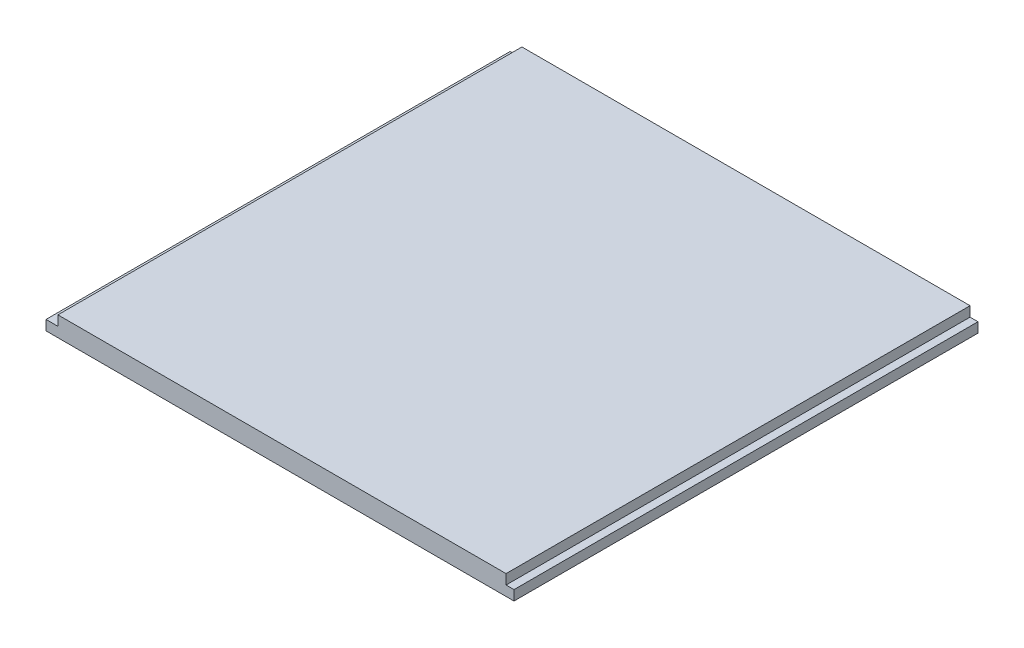
ISO-10303-21;
HEADER;
FILE_DESCRIPTION(('STEP AP214'),'2;1');
FILE_NAME('part.step','',(''),(''),'','','');
FILE_SCHEMA(('AUTOMOTIVE_DESIGN { 1 0 10303 214 1 1 1 1 }'));
ENDSEC;
DATA;
#1=APPLICATION_CONTEXT('core data for automotive mechanical design processes');
#2=APPLICATION_PROTOCOL_DEFINITION('international standard','automotive_design',2000,#1);
#3=PRODUCT_CONTEXT('',#1,'mechanical');
#4=PRODUCT('Part','Part','',(#3));
#5=PRODUCT_RELATED_PRODUCT_CATEGORY('part','',(#4));
#6=PRODUCT_DEFINITION_FORMATION('','',#4);
#7=PRODUCT_DEFINITION_CONTEXT('part definition',#1,'design');
#8=PRODUCT_DEFINITION('design','',#6,#7);
#9=PRODUCT_DEFINITION_SHAPE('','',#8);
#10=(LENGTH_UNIT() NAMED_UNIT(*) SI_UNIT(.MILLI.,.METRE.));
#11=(NAMED_UNIT(*) PLANE_ANGLE_UNIT() SI_UNIT($,.RADIAN.));
#12=(NAMED_UNIT(*) SI_UNIT($,.STERADIAN.) SOLID_ANGLE_UNIT());
#13=UNCERTAINTY_MEASURE_WITH_UNIT(LENGTH_MEASURE(1.E-05),#10,'distance_accuracy_value','');
#14=(GEOMETRIC_REPRESENTATION_CONTEXT(3) GLOBAL_UNCERTAINTY_ASSIGNED_CONTEXT((#13)) GLOBAL_UNIT_ASSIGNED_CONTEXT((#10,
#11,#12)) REPRESENTATION_CONTEXT('',''));
#15=CARTESIAN_POINT('',(0.,0.,0.));
#16=DIRECTION('',(0.,0.,1.));
#17=DIRECTION('',(1.,0.,0.));
#18=AXIS2_PLACEMENT_3D('',#15,#16,#17);
#19=CARTESIAN_POINT('',(-34.0032258064516,-27.441935483871,117.));
#20=DIRECTION('',(-1.,0.,0.));
#21=DIRECTION('',(0.,0.,1.));
#22=AXIS2_PLACEMENT_3D('',#19,#20,#21);
#23=PLANE('',#22);
#24=DIRECTION('',(0.,1.,0.));
#25=VECTOR('',#24,1.);
#26=CARTESIAN_POINT('',(-34.0032258064516,-27.441935483871,0.));
#27=LINE('',#26,#25);
#28=CARTESIAN_POINT('',(-34.0032258064516,-27.441935483871,0.));
#29=VERTEX_POINT('',#28);
#30=CARTESIAN_POINT('',(-34.0032258064516,-24.941935483871,0.));
#31=VERTEX_POINT('',#30);
#32=EDGE_CURVE('E102',#29,#31,#27,.T.);
#33=ORIENTED_EDGE('',*,*,#32,.F.);
#34=DIRECTION('',(0.,0.,-1.));
#35=VECTOR('',#34,1.);
#36=CARTESIAN_POINT('',(-34.0032258064516,-27.441935483871,117.));
#37=LINE('',#36,#35);
#38=CARTESIAN_POINT('',(-34.0032258064516,-27.441935483871,117.));
#39=VERTEX_POINT('',#38);
#40=EDGE_CURVE('E11',#39,#29,#37,.T.);
#41=ORIENTED_EDGE('',*,*,#40,.F.);
#42=DIRECTION('',(0.,1.,0.));
#43=VECTOR('',#42,1.);
#44=CARTESIAN_POINT('',(-34.0032258064516,-27.441935483871,117.));
#45=LINE('',#44,#43);
#46=CARTESIAN_POINT('',(-34.0032258064516,-24.941935483871,117.));
#47=VERTEX_POINT('',#46);
#48=EDGE_CURVE('E149',#39,#47,#45,.T.);
#49=ORIENTED_EDGE('',*,*,#48,.T.);
#50=DIRECTION('',(0.,0.,-1.));
#51=VECTOR('',#50,1.);
#52=CARTESIAN_POINT('',(-34.0032258064516,-24.941935483871,117.));
#53=LINE('',#52,#51);
#54=EDGE_CURVE('E140',#47,#31,#53,.T.);
#55=ORIENTED_EDGE('',*,*,#54,.T.);
#56=EDGE_LOOP('',(#33,#41,#49,#55));
#57=FACE_BOUND('',#56,.T.);
#58=ADVANCED_FACE('F33',(#57),#23,.T.);
#59=CARTESIAN_POINT('',(78.9967741935484,-27.441935483871,117.));
#60=DIRECTION('',(-1.,0.,0.));
#61=DIRECTION('',(0.,0.,1.));
#62=AXIS2_PLACEMENT_3D('',#59,#60,#61);
#63=PLANE('',#62);
#64=DIRECTION('',(0.,1.,0.));
#65=VECTOR('',#64,1.);
#66=CARTESIAN_POINT('',(78.9967741935484,-27.441935483871,0.));
#67=LINE('',#66,#65);
#68=CARTESIAN_POINT('',(78.9967741935484,-27.441935483871,0.));
#69=VERTEX_POINT('',#68);
#70=CARTESIAN_POINT('',(78.9967741935484,-24.941935483871,0.));
#71=VERTEX_POINT('',#70);
#72=EDGE_CURVE('E146',#69,#71,#67,.T.);
#73=ORIENTED_EDGE('',*,*,#72,.T.);
#74=DIRECTION('',(0.,0.,-1.));
#75=VECTOR('',#74,1.);
#76=CARTESIAN_POINT('',(78.9967741935484,-24.941935483871,117.));
#77=LINE('',#76,#75);
#78=CARTESIAN_POINT('',(78.9967741935484,-24.941935483871,117.));
#79=VERTEX_POINT('',#78);
#80=EDGE_CURVE('E142',#79,#71,#77,.T.);
#81=ORIENTED_EDGE('',*,*,#80,.F.);
#82=DIRECTION('',(0.,1.,0.));
#83=VECTOR('',#82,1.);
#84=CARTESIAN_POINT('',(78.9967741935484,-27.441935483871,117.));
#85=LINE('',#84,#83);
#86=CARTESIAN_POINT('',(78.9967741935484,-27.441935483871,117.));
#87=VERTEX_POINT('',#86);
#88=EDGE_CURVE('E143',#87,#79,#85,.T.);
#89=ORIENTED_EDGE('',*,*,#88,.F.);
#90=DIRECTION('',(0.,0.,-1.));
#91=VECTOR('',#90,1.);
#92=CARTESIAN_POINT('',(78.9967741935484,-27.441935483871,117.));
#93=LINE('',#92,#91);
#94=EDGE_CURVE('E43',#87,#69,#93,.T.);
#95=ORIENTED_EDGE('',*,*,#94,.T.);
#96=EDGE_LOOP('',(#73,#81,#89,#95));
#97=FACE_BOUND('',#96,.T.);
#98=ADVANCED_FACE('F182',(#97),#63,.F.);
#99=CARTESIAN_POINT('',(-34.0032258064516,-24.941935483871,117.));
#100=DIRECTION('',(0.,1.,0.));
#101=DIRECTION('',(0.,0.,1.));
#102=AXIS2_PLACEMENT_3D('',#99,#100,#101);
#103=PLANE('',#102);
#104=DIRECTION('',(1.,0.,0.));
#105=VECTOR('',#104,1.);
#106=CARTESIAN_POINT('',(-34.0032258064516,-24.941935483871,0.));
#107=LINE('',#106,#105);
#108=EDGE_CURVE('E150',#31,#71,#107,.T.);
#109=ORIENTED_EDGE('',*,*,#108,.F.);
#110=ORIENTED_EDGE('',*,*,#54,.F.);
#111=DIRECTION('',(1.,0.,0.));
#112=VECTOR('',#111,1.);
#113=CARTESIAN_POINT('',(-34.0032258064516,-24.941935483871,117.));
#114=LINE('',#113,#112);
#115=EDGE_CURVE('E156',#47,#79,#114,.T.);
#116=ORIENTED_EDGE('',*,*,#115,.T.);
#117=ORIENTED_EDGE('',*,*,#80,.T.);
#118=EDGE_LOOP('',(#109,#110,#116,#117));
#119=FACE_BOUND('',#118,.T.);
#120=ADVANCED_FACE('F169',(#119),#103,.T.);
#121=CARTESIAN_POINT('',(0.,0.,117.));
#122=DIRECTION('',(0.,0.,-1.));
#123=DIRECTION('',(-1.,0.,0.));
#124=AXIS2_PLACEMENT_3D('',#121,#122,#123);
#125=PLANE('',#124);
#126=ORIENTED_EDGE('',*,*,#48,.F.);
#127=DIRECTION('',(1.,0.,0.));
#128=VECTOR('',#127,1.);
#129=CARTESIAN_POINT('',(-37.0032258064516,-27.441935483871,117.));
#130=LINE('',#129,#128);
#131=CARTESIAN_POINT('',(-37.0032258064516,-27.441935483871,117.));
#132=VERTEX_POINT('',#131);
#133=EDGE_CURVE('E133',#132,#39,#130,.T.);
#134=ORIENTED_EDGE('',*,*,#133,.F.);
#135=DIRECTION('',(0.,1.,0.));
#136=VECTOR('',#135,1.);
#137=CARTESIAN_POINT('',(-37.0032258064516,-29.941935483871,117.));
#138=LINE('',#137,#136);
#139=CARTESIAN_POINT('',(-37.0032258064516,-29.941935483871,117.));
#140=VERTEX_POINT('',#139);
#141=EDGE_CURVE('E114',#140,#132,#138,.T.);
#142=ORIENTED_EDGE('',*,*,#141,.F.);
#143=DIRECTION('',(1.,0.,0.));
#144=VECTOR('',#143,1.);
#145=CARTESIAN_POINT('',(-37.0032258064516,-29.941935483871,117.));
#146=LINE('',#145,#144);
#147=CARTESIAN_POINT('',(80.9967741935484,-29.941935483871,117.));
#148=VERTEX_POINT('',#147);
#149=EDGE_CURVE('E97',#140,#148,#146,.T.);
#150=ORIENTED_EDGE('',*,*,#149,.T.);
#151=DIRECTION('',(0.,1.,0.));
#152=VECTOR('',#151,1.);
#153=CARTESIAN_POINT('',(80.9967741935484,-29.941935483871,117.));
#154=LINE('',#153,#152);
#155=CARTESIAN_POINT('',(80.9967741935484,-27.441935483871,117.));
#156=VERTEX_POINT('',#155);
#157=EDGE_CURVE('E130',#148,#156,#154,.T.);
#158=ORIENTED_EDGE('',*,*,#157,.T.);
#159=EDGE_CURVE('E136',#87,#156,#130,.T.);
#160=ORIENTED_EDGE('',*,*,#159,.F.);
#161=ORIENTED_EDGE('',*,*,#88,.T.);
#162=ORIENTED_EDGE('',*,*,#115,.F.);
#163=EDGE_LOOP('',(#126,#134,#142,#150,#158,#160,#161,#162));
#164=FACE_BOUND('',#163,.T.);
#165=ADVANCED_FACE('F165',(#164),#125,.F.);
#166=CARTESIAN_POINT('',(0.,0.,0.));
#167=DIRECTION('',(0.,0.,-1.));
#168=DIRECTION('',(-1.,0.,0.));
#169=AXIS2_PLACEMENT_3D('',#166,#167,#168);
#170=PLANE('',#169);
#171=ORIENTED_EDGE('',*,*,#32,.T.);
#172=ORIENTED_EDGE('',*,*,#108,.T.);
#173=ORIENTED_EDGE('',*,*,#72,.F.);
#174=DIRECTION('',(1.,0.,0.));
#175=VECTOR('',#174,1.);
#176=CARTESIAN_POINT('',(-37.0032258064516,-27.441935483871,0.));
#177=LINE('',#176,#175);
#178=CARTESIAN_POINT('',(80.9967741935484,-27.441935483871,0.));
#179=VERTEX_POINT('',#178);
#180=EDGE_CURVE('E117',#69,#179,#177,.T.);
#181=ORIENTED_EDGE('',*,*,#180,.T.);
#182=DIRECTION('',(0.,1.,0.));
#183=VECTOR('',#182,1.);
#184=CARTESIAN_POINT('',(80.9967741935484,-29.941935483871,0.));
#185=LINE('',#184,#183);
#186=CARTESIAN_POINT('',(80.9967741935484,-29.941935483871,0.));
#187=VERTEX_POINT('',#186);
#188=EDGE_CURVE('E113',#187,#179,#185,.T.);
#189=ORIENTED_EDGE('',*,*,#188,.F.);
#190=DIRECTION('',(1.,0.,0.));
#191=VECTOR('',#190,1.);
#192=CARTESIAN_POINT('',(-37.0032258064516,-29.941935483871,0.));
#193=LINE('',#192,#191);
#194=CARTESIAN_POINT('',(-37.0032258064516,-29.941935483871,0.));
#195=VERTEX_POINT('',#194);
#196=EDGE_CURVE('E92',#195,#187,#193,.T.);
#197=ORIENTED_EDGE('',*,*,#196,.F.);
#198=DIRECTION('',(0.,1.,0.));
#199=VECTOR('',#198,1.);
#200=CARTESIAN_POINT('',(-37.0032258064516,-29.941935483871,0.));
#201=LINE('',#200,#199);
#202=CARTESIAN_POINT('',(-37.0032258064516,-27.441935483871,0.));
#203=VERTEX_POINT('',#202);
#204=EDGE_CURVE('E111',#195,#203,#201,.T.);
#205=ORIENTED_EDGE('',*,*,#204,.T.);
#206=EDGE_CURVE('E119',#203,#29,#177,.T.);
#207=ORIENTED_EDGE('',*,*,#206,.T.);
#208=EDGE_LOOP('',(#171,#172,#173,#181,#189,#197,#205,#207));
#209=FACE_BOUND('',#208,.T.);
#210=ADVANCED_FACE('F109',(#209),#170,.T.);
#211=CARTESIAN_POINT('',(-37.0032258064516,-29.941935483871,117.));
#212=DIRECTION('',(0.,1.,0.));
#213=DIRECTION('',(0.,0.,1.));
#214=AXIS2_PLACEMENT_3D('',#211,#212,#213);
#215=PLANE('',#214);
#216=ORIENTED_EDGE('',*,*,#196,.T.);
#217=DIRECTION('',(0.,0.,-1.));
#218=VECTOR('',#217,1.);
#219=CARTESIAN_POINT('',(80.9967741935484,-29.941935483871,117.));
#220=LINE('',#219,#218);
#221=EDGE_CURVE('E103',#148,#187,#220,.T.);
#222=ORIENTED_EDGE('',*,*,#221,.F.);
#223=ORIENTED_EDGE('',*,*,#149,.F.);
#224=DIRECTION('',(0.,0.,-1.));
#225=VECTOR('',#224,1.);
#226=CARTESIAN_POINT('',(-37.0032258064516,-29.941935483871,117.));
#227=LINE('',#226,#225);
#228=EDGE_CURVE('E95',#140,#195,#227,.T.);
#229=ORIENTED_EDGE('',*,*,#228,.T.);
#230=EDGE_LOOP('',(#216,#222,#223,#229));
#231=FACE_BOUND('',#230,.T.);
#232=ADVANCED_FACE('F96',(#231),#215,.F.);
#233=CARTESIAN_POINT('',(80.9967741935484,-29.941935483871,117.));
#234=DIRECTION('',(-1.,0.,0.));
#235=DIRECTION('',(0.,0.,1.));
#236=AXIS2_PLACEMENT_3D('',#233,#234,#235);
#237=PLANE('',#236);
#238=ORIENTED_EDGE('',*,*,#188,.T.);
#239=DIRECTION('',(0.,0.,-1.));
#240=VECTOR('',#239,1.);
#241=CARTESIAN_POINT('',(80.9967741935484,-27.441935483871,117.));
#242=LINE('',#241,#240);
#243=EDGE_CURVE('E125',#156,#179,#242,.T.);
#244=ORIENTED_EDGE('',*,*,#243,.F.);
#245=ORIENTED_EDGE('',*,*,#157,.F.);
#246=ORIENTED_EDGE('',*,*,#221,.T.);
#247=EDGE_LOOP('',(#238,#244,#245,#246));
#248=FACE_BOUND('',#247,.T.);
#249=ADVANCED_FACE('F175',(#248),#237,.F.);
#250=CARTESIAN_POINT('',(-37.0032258064516,-29.941935483871,117.));
#251=DIRECTION('',(-1.,0.,0.));
#252=DIRECTION('',(0.,0.,1.));
#253=AXIS2_PLACEMENT_3D('',#250,#251,#252);
#254=PLANE('',#253);
#255=ORIENTED_EDGE('',*,*,#204,.F.);
#256=ORIENTED_EDGE('',*,*,#228,.F.);
#257=ORIENTED_EDGE('',*,*,#141,.T.);
#258=DIRECTION('',(0.,0.,-1.));
#259=VECTOR('',#258,1.);
#260=CARTESIAN_POINT('',(-37.0032258064516,-27.441935483871,117.));
#261=LINE('',#260,#259);
#262=EDGE_CURVE('E37',#132,#203,#261,.T.);
#263=ORIENTED_EDGE('',*,*,#262,.T.);
#264=EDGE_LOOP('',(#255,#256,#257,#263));
#265=FACE_BOUND('',#264,.T.);
#266=ADVANCED_FACE('F35',(#265),#254,.T.);
#267=CARTESIAN_POINT('',(-37.0032258064516,-27.441935483871,117.));
#268=DIRECTION('',(0.,1.,0.));
#269=DIRECTION('',(0.,0.,1.));
#270=AXIS2_PLACEMENT_3D('',#267,#268,#269);
#271=PLANE('',#270);
#272=ORIENTED_EDGE('',*,*,#133,.T.);
#273=ORIENTED_EDGE('',*,*,#40,.T.);
#274=ORIENTED_EDGE('',*,*,#206,.F.);
#275=ORIENTED_EDGE('',*,*,#262,.F.);
#276=EDGE_LOOP('',(#272,#273,#274,#275));
#277=FACE_BOUND('',#276,.T.);
#278=ADVANCED_FACE('F172',(#277),#271,.T.);
#279=ORIENTED_EDGE('',*,*,#94,.F.);
#280=ORIENTED_EDGE('',*,*,#159,.T.);
#281=ORIENTED_EDGE('',*,*,#243,.T.);
#282=ORIENTED_EDGE('',*,*,#180,.F.);
#283=EDGE_LOOP('',(#279,#280,#281,#282));
#284=FACE_BOUND('',#283,.T.);
#285=ADVANCED_FACE('F174',(#284),#271,.T.);
#286=CLOSED_SHELL('',(#58,#98,#120,#165,#210,#232,#249,#266,#278,#285));
#287=MANIFOLD_SOLID_BREP('B2',#286);
#288=ADVANCED_BREP_SHAPE_REPRESENTATION('',(#18,#287),#14);
#289=SHAPE_DEFINITION_REPRESENTATION(#9,#288);
ENDSEC;
END-ISO-10303-21;
